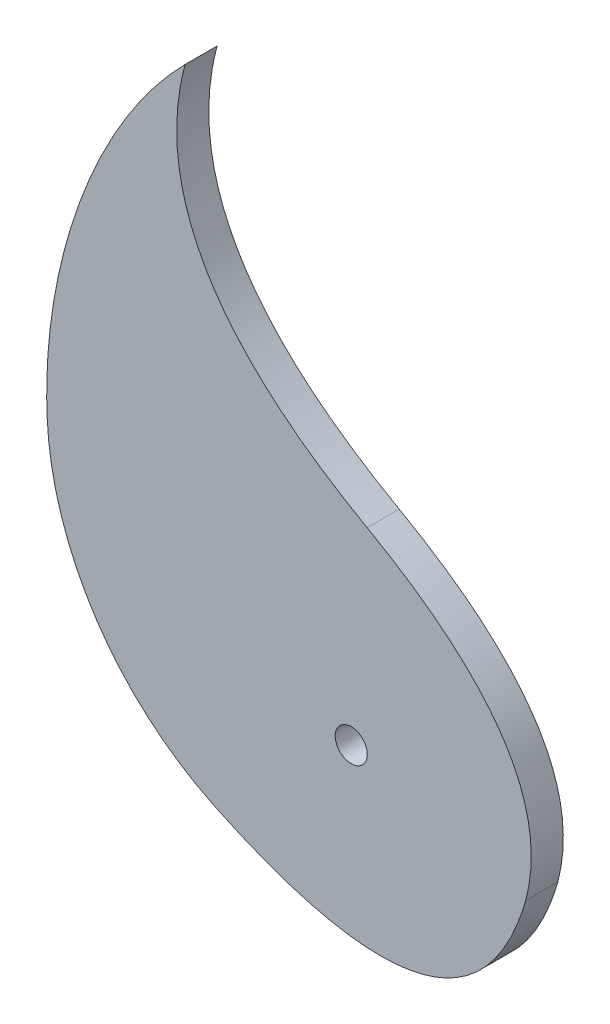
ISO-10303-21;
HEADER;
FILE_DESCRIPTION(('STEP AP214'),'2;1');
FILE_NAME('part.step','',(''),(''),'','','');
FILE_SCHEMA(('AUTOMOTIVE_DESIGN { 1 0 10303 214 1 1 1 1 }'));
ENDSEC;
DATA;
#1=APPLICATION_CONTEXT('core data for automotive mechanical design processes');
#2=APPLICATION_PROTOCOL_DEFINITION('international standard','automotive_design',2000,#1);
#3=PRODUCT_CONTEXT('',#1,'mechanical');
#4=PRODUCT('Part','Part','',(#3));
#5=PRODUCT_RELATED_PRODUCT_CATEGORY('part','',(#4));
#6=PRODUCT_DEFINITION_FORMATION('','',#4);
#7=PRODUCT_DEFINITION_CONTEXT('part definition',#1,'design');
#8=PRODUCT_DEFINITION('design','',#6,#7);
#9=PRODUCT_DEFINITION_SHAPE('','',#8);
#10=(LENGTH_UNIT() NAMED_UNIT(*) SI_UNIT(.MILLI.,.METRE.));
#11=(NAMED_UNIT(*) PLANE_ANGLE_UNIT() SI_UNIT($,.RADIAN.));
#12=(NAMED_UNIT(*) SI_UNIT($,.STERADIAN.) SOLID_ANGLE_UNIT());
#13=UNCERTAINTY_MEASURE_WITH_UNIT(LENGTH_MEASURE(1.E-05),#10,'distance_accuracy_value','');
#14=(GEOMETRIC_REPRESENTATION_CONTEXT(3) GLOBAL_UNCERTAINTY_ASSIGNED_CONTEXT((#13)) GLOBAL_UNIT_ASSIGNED_CONTEXT((#10,
#11,#12)) REPRESENTATION_CONTEXT('',''));
#15=CARTESIAN_POINT('',(0.,0.,0.));
#16=DIRECTION('',(0.,0.,1.));
#17=DIRECTION('',(1.,0.,0.));
#18=AXIS2_PLACEMENT_3D('',#15,#16,#17);
#19=CARTESIAN_POINT('',(0.,0.,6.35));
#20=CARTESIAN_POINT('',(43.574547172754,-24.507814476658,6.35));
#21=CARTESIAN_POINT('',(28.6921284554496,-55.4732110384951,6.35));
#22=B_SPLINE_CURVE_WITH_KNOTS('',2,(#19,#20,#21),.UNSPECIFIED.,.F.,.F.,(3,3),(0.,1.),.UNSPECIFIED.);
#23=DIRECTION('',(0.,0.,-1.));
#24=VECTOR('',#23,1.);
#25=SURFACE_OF_LINEAR_EXTRUSION('',#22,#24);
#26=CARTESIAN_POINT('',(0.,0.,0.));
#27=CARTESIAN_POINT('',(43.574547172754,-24.507814476658,0.));
#28=CARTESIAN_POINT('',(28.6921284554496,-55.4732110384951,0.));
#29=B_SPLINE_CURVE_WITH_KNOTS('',2,(#26,#27,#28),.UNSPECIFIED.,.F.,.F.,(3,3),(0.,1.),.UNSPECIFIED.);
#30=CARTESIAN_POINT('',(0.,0.,0.));
#31=VERTEX_POINT('',#30);
#32=CARTESIAN_POINT('',(31.4008996586547,-48.2155749597408,0.));
#33=VERTEX_POINT('',#32);
#34=EDGE_CURVE('E99',#31,#33,#29,.T.);
#35=ORIENTED_EDGE('',*,*,#34,.F.);
#36=DIRECTION('',(0.,0.,-1.));
#37=VECTOR('',#36,1.);
#38=CARTESIAN_POINT('',(0.,0.,6.35));
#39=LINE('',#38,#37);
#40=CARTESIAN_POINT('',(0.,0.,6.35));
#41=VERTEX_POINT('',#40);
#42=EDGE_CURVE('E93',#41,#31,#39,.T.);
#43=ORIENTED_EDGE('',*,*,#42,.F.);
#44=CARTESIAN_POINT('',(31.4008996586547,-48.2155749597408,6.35));
#45=VERTEX_POINT('',#44);
#46=EDGE_CURVE('E97',#41,#45,#22,.T.);
#47=ORIENTED_EDGE('',*,*,#46,.T.);
#48=DIRECTION('',(0.,0.,-1.));
#49=VECTOR('',#48,1.);
#50=CARTESIAN_POINT('',(31.4008996586547,-48.2155749597408,6.35));
#51=LINE('',#50,#49);
#52=EDGE_CURVE('E158',#45,#33,#51,.T.);
#53=ORIENTED_EDGE('',*,*,#52,.T.);
#54=EDGE_LOOP('',(#35,#43,#47,#53));
#55=FACE_BOUND('',#54,.T.);
#56=ADVANCED_FACE('F45',(#55),#25,.T.);
#57=CARTESIAN_POINT('',(0.,0.,6.35));
#58=CARTESIAN_POINT('',(-45.5752908208285,25.610850896988,6.35));
#59=CARTESIAN_POINT('',(-36.0603879951002,61.3836941714346,6.35));
#60=B_SPLINE_CURVE_WITH_KNOTS('',2,(#57,#58,#59),.UNSPECIFIED.,.F.,.F.,(3,3),(0.,1.),.UNSPECIFIED.);
#61=DIRECTION('',(0.,0.,-1.));
#62=VECTOR('',#61,1.);
#63=SURFACE_OF_LINEAR_EXTRUSION('',#60,#62);
#64=CARTESIAN_POINT('',(0.,0.,0.));
#65=CARTESIAN_POINT('',(-45.5752908208285,25.610850896988,0.));
#66=CARTESIAN_POINT('',(-36.0603879951002,61.3836941714346,0.));
#67=B_SPLINE_CURVE_WITH_KNOTS('',2,(#64,#65,#66),.UNSPECIFIED.,.F.,.F.,(3,3),(0.,1.),.UNSPECIFIED.);
#68=CARTESIAN_POINT('',(-36.0603879951002,61.3836941714346,0.));
#69=VERTEX_POINT('',#68);
#70=EDGE_CURVE('E166',#31,#69,#67,.T.);
#71=ORIENTED_EDGE('',*,*,#70,.T.);
#72=DIRECTION('',(0.,0.,-1.));
#73=VECTOR('',#72,1.);
#74=CARTESIAN_POINT('',(-36.0603879951002,61.3836941714346,6.35));
#75=LINE('',#74,#73);
#76=CARTESIAN_POINT('',(-36.0603879951002,61.3836941714346,6.35));
#77=VERTEX_POINT('',#76);
#78=EDGE_CURVE('E104',#77,#69,#75,.T.);
#79=ORIENTED_EDGE('',*,*,#78,.F.);
#80=EDGE_CURVE('E107',#41,#77,#60,.T.);
#81=ORIENTED_EDGE('',*,*,#80,.F.);
#82=ORIENTED_EDGE('',*,*,#42,.T.);
#83=EDGE_LOOP('',(#71,#79,#81,#82));
#84=FACE_BOUND('',#83,.T.);
#85=ADVANCED_FACE('F108',(#84),#63,.F.);
#86=CARTESIAN_POINT('',(-36.0603879951002,61.3836941714346,6.35));
#87=CARTESIAN_POINT('',(-62.6152865415465,34.5943921788886,6.35));
#88=CARTESIAN_POINT('',(-74.1164085770785,-18.8708149926286,6.35));
#89=CARTESIAN_POINT('',(-51.0517852514902,-51.2543717009009,6.35));
#90=B_SPLINE_CURVE_WITH_KNOTS('',3,(#86,#87,#88,#89),.UNSPECIFIED.,.F.,.F.,(4,4),(0.,1.),.UNSPECIFIED.);
#91=DIRECTION('',(0.,0.,-1.));
#92=VECTOR('',#91,1.);
#93=SURFACE_OF_LINEAR_EXTRUSION('',#90,#92);
#94=CARTESIAN_POINT('',(-36.0603879951002,61.3836941714346,0.));
#95=CARTESIAN_POINT('',(-62.6152865415465,34.5943921788886,0.));
#96=CARTESIAN_POINT('',(-74.1164085770785,-18.8708149926286,0.));
#97=CARTESIAN_POINT('',(-51.0517852514902,-51.2543717009009,0.));
#98=B_SPLINE_CURVE_WITH_KNOTS('',3,(#94,#95,#96,#97),.UNSPECIFIED.,.F.,.F.,(4,4),(0.,1.),.UNSPECIFIED.);
#99=CARTESIAN_POINT('',(-63.3639879501295,-12.6319354502583,0.));
#100=VERTEX_POINT('',#99);
#101=EDGE_CURVE('E122',#69,#100,#98,.T.);
#102=ORIENTED_EDGE('',*,*,#101,.T.);
#103=DIRECTION('',(0.,0.,-1.));
#104=VECTOR('',#103,1.);
#105=CARTESIAN_POINT('',(-63.3639879501295,-12.6319354502583,0.));
#106=LINE('',#105,#104);
#107=CARTESIAN_POINT('',(-63.3639879501295,-12.6319354502583,6.35));
#108=VERTEX_POINT('',#107);
#109=EDGE_CURVE('E54',#100,#108,#106,.F.);
#110=ORIENTED_EDGE('',*,*,#109,.T.);
#111=EDGE_CURVE('E112',#77,#108,#90,.T.);
#112=ORIENTED_EDGE('',*,*,#111,.F.);
#113=ORIENTED_EDGE('',*,*,#78,.T.);
#114=EDGE_LOOP('',(#102,#110,#112,#113));
#115=FACE_BOUND('',#114,.T.);
#116=ADVANCED_FACE('F140',(#115),#93,.F.);
#117=CARTESIAN_POINT('',(-51.0517852514902,-51.2543717009009,6.35));
#118=CARTESIAN_POINT('',(17.9717505803727,-94.4029174628285,6.35));
#119=CARTESIAN_POINT('',(31.4008996586547,-48.2155749597408,6.35));
#120=B_SPLINE_CURVE_WITH_KNOTS('',2,(#117,#118,#119),.UNSPECIFIED.,.F.,.F.,(3,3),(0.,1.),.UNSPECIFIED.);
#121=DIRECTION('',(0.,0.,-1.));
#122=VECTOR('',#121,1.);
#123=SURFACE_OF_LINEAR_EXTRUSION('',#120,#122);
#124=CARTESIAN_POINT('',(-30.2028333618769,-62.8633643031668,6.35));
#125=VERTEX_POINT('',#124);
#126=EDGE_CURVE('E116',#125,#45,#120,.T.);
#127=ORIENTED_EDGE('',*,*,#126,.F.);
#128=DIRECTION('',(0.,0.,-1.));
#129=VECTOR('',#128,1.);
#130=CARTESIAN_POINT('',(-30.2028333618769,-62.8633643031668,6.35));
#131=LINE('',#130,#129);
#132=CARTESIAN_POINT('',(-30.2028333618769,-62.8633643031668,0.));
#133=VERTEX_POINT('',#132);
#134=EDGE_CURVE('E103',#125,#133,#131,.T.);
#135=ORIENTED_EDGE('',*,*,#134,.T.);
#136=CARTESIAN_POINT('',(-51.0517852514902,-51.2543717009009,0.));
#137=CARTESIAN_POINT('',(17.9717505803727,-94.4029174628285,0.));
#138=CARTESIAN_POINT('',(31.4008996586547,-48.2155749597408,0.));
#139=B_SPLINE_CURVE_WITH_KNOTS('',2,(#136,#137,#138),.UNSPECIFIED.,.F.,.F.,(3,3),(0.,1.),.UNSPECIFIED.);
#140=EDGE_CURVE('E119',#133,#33,#139,.T.);
#141=ORIENTED_EDGE('',*,*,#140,.T.);
#142=ORIENTED_EDGE('',*,*,#52,.F.);
#143=EDGE_LOOP('',(#127,#135,#141,#142));
#144=FACE_BOUND('',#143,.T.);
#145=ADVANCED_FACE('F143',(#144),#123,.F.);
#146=CARTESIAN_POINT('',(0.,0.,6.35));
#147=DIRECTION('',(0.,0.,1.));
#148=DIRECTION('',(1.,0.,0.));
#149=AXIS2_PLACEMENT_3D('',#146,#147,#148);
#150=PLANE('',#149);
#151=CARTESIAN_POINT('',(-3.15246977092004,-38.8713853505438,6.35));
#152=DIRECTION('',(0.,0.,1.));
#153=DIRECTION('',(1.,0.,0.));
#154=AXIS2_PLACEMENT_3D('',#151,#152,#153);
#155=CIRCLE('',#154,3.175);
#156=CARTESIAN_POINT('',(0.0225302290799579,-38.8713853505438,6.34999999999999));
#157=VERTEX_POINT('',#156);
#158=EDGE_CURVE('E128',#157,#157,#155,.T.);
#159=ORIENTED_EDGE('',*,*,#158,.F.);
#160=EDGE_LOOP('',(#159));
#161=FACE_BOUND('',#160,.T.);
#162=ORIENTED_EDGE('',*,*,#111,.T.);
#163=CARTESIAN_POINT('',(-4.99626109248077,-10.1611336632052,6.35));
#164=DIRECTION('',(0.,0.,1.));
#165=DIRECTION('',(1.,0.,0.));
#166=AXIS2_PLACEMENT_3D('',#163,#164,#165);
#167=CIRCLE('',#166,58.42);
#168=EDGE_CURVE('E11',#108,#125,#167,.T.);
#169=ORIENTED_EDGE('',*,*,#168,.T.);
#170=ORIENTED_EDGE('',*,*,#126,.T.);
#171=ORIENTED_EDGE('',*,*,#46,.F.);
#172=ORIENTED_EDGE('',*,*,#80,.T.);
#173=EDGE_LOOP('',(#162,#169,#170,#171,#172));
#174=FACE_BOUND('',#173,.T.);
#175=ADVANCED_FACE('F114',(#161,#174),#150,.T.);
#176=CARTESIAN_POINT('',(0.,0.,0.));
#177=DIRECTION('',(0.,0.,1.));
#178=DIRECTION('',(1.,0.,0.));
#179=AXIS2_PLACEMENT_3D('',#176,#177,#178);
#180=PLANE('',#179);
#181=CARTESIAN_POINT('',(-3.15246977092004,-38.8713853505438,0.));
#182=DIRECTION('',(0.,0.,1.));
#183=DIRECTION('',(1.,0.,0.));
#184=AXIS2_PLACEMENT_3D('',#181,#182,#183);
#185=CIRCLE('',#184,3.175);
#186=CARTESIAN_POINT('',(0.0225302290799579,-38.8713853505438,0.));
#187=VERTEX_POINT('',#186);
#188=EDGE_CURVE('E167',#187,#187,#185,.T.);
#189=ORIENTED_EDGE('',*,*,#188,.T.);
#190=EDGE_LOOP('',(#189));
#191=FACE_BOUND('',#190,.T.);
#192=ORIENTED_EDGE('',*,*,#140,.F.);
#193=CARTESIAN_POINT('',(-4.99626109248077,-10.1611336632052,0.));
#194=DIRECTION('',(0.,0.,1.));
#195=DIRECTION('',(1.,0.,0.));
#196=AXIS2_PLACEMENT_3D('',#193,#194,#195);
#197=CIRCLE('',#196,58.42);
#198=EDGE_CURVE('E68',#133,#100,#197,.F.);
#199=ORIENTED_EDGE('',*,*,#198,.T.);
#200=ORIENTED_EDGE('',*,*,#101,.F.);
#201=ORIENTED_EDGE('',*,*,#70,.F.);
#202=ORIENTED_EDGE('',*,*,#34,.T.);
#203=EDGE_LOOP('',(#192,#199,#200,#201,#202));
#204=FACE_BOUND('',#203,.T.);
#205=ADVANCED_FACE('F206',(#191,#204),#180,.F.);
#206=CARTESIAN_POINT('',(-3.15246977092004,-38.8713853505438,-69.85));
#207=DIRECTION('',(0.,0.,1.));
#208=DIRECTION('',(1.,0.,0.));
#209=AXIS2_PLACEMENT_3D('',#206,#207,#208);
#210=CYLINDRICAL_SURFACE('',#209,3.175);
#211=CARTESIAN_POINT('',(0.0225302290799579,-38.8713853505438,6.34999999999999));
#212=CARTESIAN_POINT('',(0.0225302290799579,-38.8713853505438,6.28385416666666));
#213=CARTESIAN_POINT('',(0.0225302290799579,-38.8713853505438,6.21770833333333));
#214=CARTESIAN_POINT('',(0.0225302290799579,-38.8713853505438,6.08541666666666));
#215=CARTESIAN_POINT('',(0.0225302290799579,-38.8713853505438,6.01927083333333));
#216=CARTESIAN_POINT('',(0.0225302290799579,-38.8713853505438,5.88697916666666));
#217=CARTESIAN_POINT('',(0.0225302290799579,-38.8713853505438,5.82083333333333));
#218=CARTESIAN_POINT('',(0.0225302290799579,-38.8713853505438,5.68854166666666));
#219=CARTESIAN_POINT('',(0.0225302290799579,-38.8713853505438,5.62239583333333));
#220=CARTESIAN_POINT('',(0.0225302290799579,-38.8713853505438,5.49010416666666));
#221=CARTESIAN_POINT('',(0.0225302290799579,-38.8713853505438,5.42395833333333));
#222=CARTESIAN_POINT('',(0.0225302290799579,-38.8713853505438,5.29166666666666));
#223=CARTESIAN_POINT('',(0.0225302290799579,-38.8713853505438,5.22552083333333));
#224=CARTESIAN_POINT('',(0.0225302290799579,-38.8713853505438,5.09322916666666));
#225=CARTESIAN_POINT('',(0.0225302290799579,-38.8713853505438,5.02708333333333));
#226=CARTESIAN_POINT('',(0.0225302290799579,-38.8713853505438,4.89479166666667));
#227=CARTESIAN_POINT('',(0.0225302290799579,-38.8713853505438,4.82864583333333));
#228=CARTESIAN_POINT('',(0.0225302290799579,-38.8713853505438,4.69635416666667));
#229=CARTESIAN_POINT('',(0.0225302290799579,-38.8713853505438,4.63020833333333));
#230=CARTESIAN_POINT('',(0.0225302290799579,-38.8713853505438,4.49791666666666));
#231=CARTESIAN_POINT('',(0.0225302290799579,-38.8713853505438,4.43177083333333));
#232=CARTESIAN_POINT('',(0.0225302290799579,-38.8713853505438,4.29947916666667));
#233=CARTESIAN_POINT('',(0.0225302290799579,-38.8713853505438,4.23333333333333));
#234=CARTESIAN_POINT('',(0.0225302290799579,-38.8713853505438,4.10104166666667));
#235=CARTESIAN_POINT('',(0.0225302290799579,-38.8713853505438,4.03489583333333));
#236=CARTESIAN_POINT('',(0.0225302290799579,-38.8713853505438,3.90260416666666));
#237=CARTESIAN_POINT('',(0.0225302290799579,-38.8713853505438,3.83645833333333));
#238=CARTESIAN_POINT('',(0.0225302290799579,-38.8713853505438,3.70416666666667));
#239=CARTESIAN_POINT('',(0.0225302290799579,-38.8713853505438,3.63802083333333));
#240=CARTESIAN_POINT('',(0.0225302290799579,-38.8713853505438,3.50572916666667));
#241=CARTESIAN_POINT('',(0.0225302290799579,-38.8713853505438,3.43958333333333));
#242=CARTESIAN_POINT('',(0.0225302290799579,-38.8713853505438,3.30729166666666));
#243=CARTESIAN_POINT('',(0.0225302290799579,-38.8713853505438,3.24114583333333));
#244=CARTESIAN_POINT('',(0.0225302290799579,-38.8713853505438,3.10885416666667));
#245=CARTESIAN_POINT('',(0.0225302290799579,-38.8713853505438,3.04270833333333));
#246=CARTESIAN_POINT('',(0.0225302290799579,-38.8713853505438,2.91041666666667));
#247=CARTESIAN_POINT('',(0.0225302290799579,-38.8713853505438,2.84427083333333));
#248=CARTESIAN_POINT('',(0.0225302290799579,-38.8713853505438,2.71197916666666));
#249=CARTESIAN_POINT('',(0.0225302290799579,-38.8713853505438,2.64583333333333));
#250=CARTESIAN_POINT('',(0.0225302290799579,-38.8713853505438,2.51354166666667));
#251=CARTESIAN_POINT('',(0.0225302290799579,-38.8713853505438,2.44739583333333));
#252=CARTESIAN_POINT('',(0.0225302290799579,-38.8713853505438,2.31510416666667));
#253=CARTESIAN_POINT('',(0.0225302290799579,-38.8713853505438,2.24895833333333));
#254=CARTESIAN_POINT('',(0.0225302290799579,-38.8713853505438,2.11666666666666));
#255=CARTESIAN_POINT('',(0.0225302290799579,-38.8713853505438,2.05052083333333));
#256=CARTESIAN_POINT('',(0.0225302290799579,-38.8713853505438,1.91822916666666));
#257=CARTESIAN_POINT('',(0.0225302290799579,-38.8713853505438,1.85208333333333));
#258=CARTESIAN_POINT('',(0.0225302290799579,-38.8713853505438,1.71979166666666));
#259=CARTESIAN_POINT('',(0.0225302290799579,-38.8713853505438,1.65364583333333));
#260=CARTESIAN_POINT('',(0.0225302290799579,-38.8713853505438,1.52135416666666));
#261=CARTESIAN_POINT('',(0.0225302290799579,-38.8713853505438,1.45520833333333));
#262=CARTESIAN_POINT('',(0.0225302290799579,-38.8713853505438,1.32291666666666));
#263=CARTESIAN_POINT('',(0.0225302290799579,-38.8713853505438,1.25677083333333));
#264=CARTESIAN_POINT('',(0.0225302290799579,-38.8713853505438,1.12447916666667));
#265=CARTESIAN_POINT('',(0.0225302290799579,-38.8713853505438,1.05833333333334));
#266=CARTESIAN_POINT('',(0.0225302290799579,-38.8713853505438,0.926041666666669));
#267=CARTESIAN_POINT('',(0.0225302290799579,-38.8713853505438,0.859895833333332));
#268=CARTESIAN_POINT('',(0.0225302290799579,-38.8713853505438,0.727604166666664));
#269=CARTESIAN_POINT('',(0.0225302290799579,-38.8713853505438,0.661458333333332));
#270=CARTESIAN_POINT('',(0.0225302290799579,-38.8713853505438,0.529166666666669));
#271=CARTESIAN_POINT('',(0.0225302290799579,-38.8713853505438,0.463020833333337));
#272=CARTESIAN_POINT('',(0.0225302290799579,-38.8713853505438,0.330729166666668));
#273=CARTESIAN_POINT('',(0.0225302290799579,-38.8713853505438,0.264583333333332));
#274=CARTESIAN_POINT('',(0.0225302290799579,-38.8713853505438,0.132291666666664));
#275=CARTESIAN_POINT('',(0.0225302290799579,-38.8713853505438,0.0661458333333318));
#276=CARTESIAN_POINT('',(0.0225302290799579,-38.8713853505438,0.));
#277=B_SPLINE_CURVE_WITH_KNOTS('',3,(#211,#212,#213,#214,#215,#216,#217,#218,#219,#220,#221,
#222,#223,#224,#225,#226,#227,#228,#229,#230,#231,#232,#233,#234,#235,#236,#237,#238,#239,#240,
#241,#242,#243,#244,#245,#246,#247,#248,#249,#250,#251,#252,#253,#254,#255,#256,#257,#258,#259,
#260,#261,#262,#263,#264,#265,#266,#267,#268,#269,#270,#271,#272,#273,#274,#275,#276),
.UNSPECIFIED.,.F.,.F.,(4,2,2,2,2,2,2,2,2,2,2,2,2,2,2,2,2,2,2,2,2,2,2,2,2,2,2,2,2,2,2,2,4),(0.,
0.198437499999995,0.396875000000005,0.5953125,0.793749999999996,0.992187500000005,1.190625,
1.3890625,1.58749999999999,1.7859375,1.984375,2.18281249999999,2.38125,2.5796875,
2.77812499999999,2.9765625,3.175,3.37343749999999,3.571875,3.7703125,3.96874999999999,4.1671875,
4.365625,4.56406249999999,4.7625,4.9609375,5.15937499999999,5.35781249999999,5.55625,
5.75468749999999,5.95312499999999,6.1515625,6.34999999999999),.UNSPECIFIED.);
#278=EDGE_CURVE('BSEAM208',#157,#187,#277,.T.);
#279=ORIENTED_EDGE('',*,*,#158,.T.);
#280=ORIENTED_EDGE('',*,*,#188,.F.);
#281=ORIENTED_EDGE('',*,*,#278,.T.);
#282=ORIENTED_EDGE('',*,*,#278,.F.);
#283=EDGE_LOOP('',(#279,#281,#280,#282));
#284=FACE_BOUND('',#283,.T.);
#285=ADVANCED_FACE('F208',(#284),#210,.F.);
#286=CARTESIAN_POINT('',(-4.99626109248077,-10.1611336632052,3.175));
#287=DIRECTION('',(0.,0.,-1.));
#288=DIRECTION('',(-1.,0.,0.));
#289=AXIS2_PLACEMENT_3D('',#286,#287,#288);
#290=CYLINDRICAL_SURFACE('',#289,58.42);
#291=ORIENTED_EDGE('',*,*,#168,.F.);
#292=ORIENTED_EDGE('',*,*,#109,.F.);
#293=ORIENTED_EDGE('',*,*,#198,.F.);
#294=ORIENTED_EDGE('',*,*,#134,.F.);
#295=EDGE_LOOP('',(#291,#292,#293,#294));
#296=FACE_BOUND('',#295,.T.);
#297=ADVANCED_FACE('F47',(#296),#290,.T.);
#298=CLOSED_SHELL('',(#56,#85,#116,#145,#175,#205,#285,#297));
#299=MANIFOLD_SOLID_BREP('B2',#298);
#300=ADVANCED_BREP_SHAPE_REPRESENTATION('',(#18,#299),#14);
#301=SHAPE_DEFINITION_REPRESENTATION(#9,#300);
ENDSEC;
END-ISO-10303-21;
